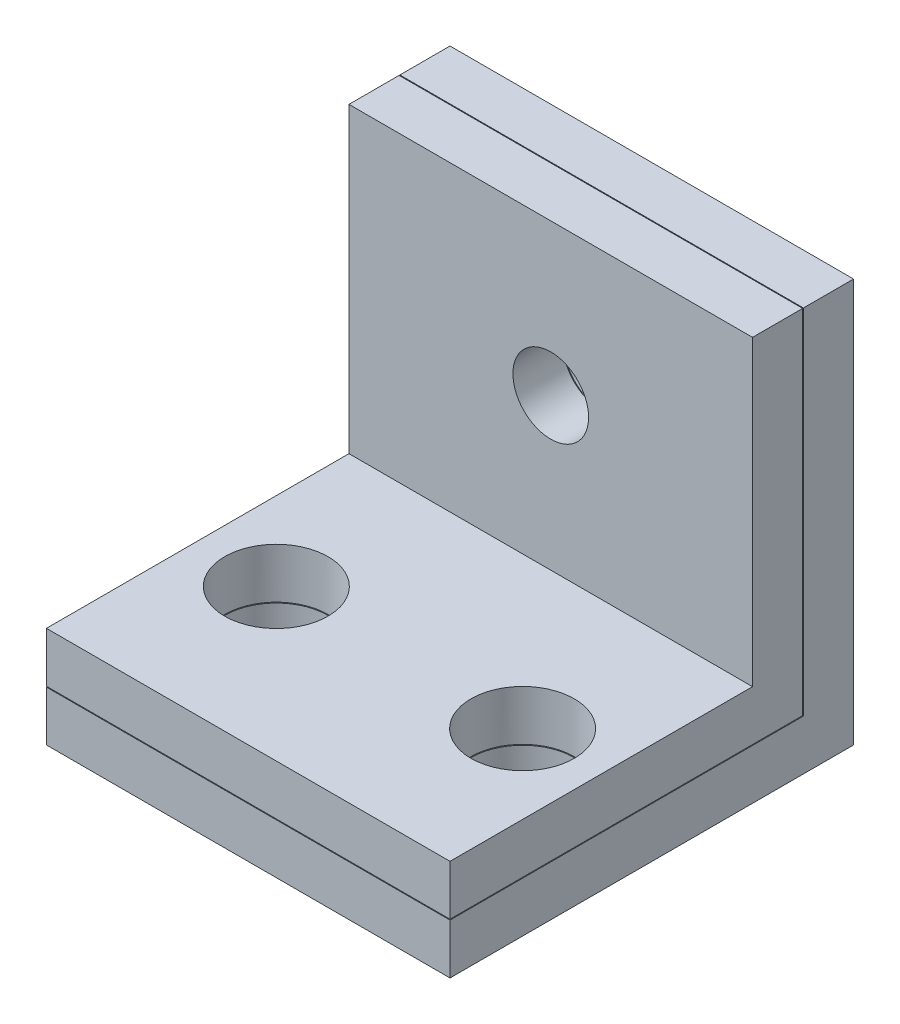
ISO-10303-21;
HEADER;
FILE_DESCRIPTION(('STEP AP214'),'2;1');
FILE_NAME('part.step','',(''),(''),'','','');
FILE_SCHEMA(('AUTOMOTIVE_DESIGN { 1 0 10303 214 1 1 1 1 }'));
ENDSEC;
DATA;
#1=APPLICATION_CONTEXT('core data for automotive mechanical design processes');
#2=APPLICATION_PROTOCOL_DEFINITION('international standard','automotive_design',2000,#1);
#3=PRODUCT_CONTEXT('',#1,'mechanical');
#4=PRODUCT('Part','Part','',(#3));
#5=PRODUCT_RELATED_PRODUCT_CATEGORY('part','',(#4));
#6=PRODUCT_DEFINITION_FORMATION('','',#4);
#7=PRODUCT_DEFINITION_CONTEXT('part definition',#1,'design');
#8=PRODUCT_DEFINITION('design','',#6,#7);
#9=PRODUCT_DEFINITION_SHAPE('','',#8);
#10=(LENGTH_UNIT() NAMED_UNIT(*) SI_UNIT(.MILLI.,.METRE.));
#11=(NAMED_UNIT(*) PLANE_ANGLE_UNIT() SI_UNIT($,.RADIAN.));
#12=(NAMED_UNIT(*) SI_UNIT($,.STERADIAN.) SOLID_ANGLE_UNIT());
#13=UNCERTAINTY_MEASURE_WITH_UNIT(LENGTH_MEASURE(1.E-05),#10,'distance_accuracy_value','');
#14=(GEOMETRIC_REPRESENTATION_CONTEXT(3) GLOBAL_UNCERTAINTY_ASSIGNED_CONTEXT((#13)) GLOBAL_UNIT_ASSIGNED_CONTEXT((#10,
#11,#12)) REPRESENTATION_CONTEXT('',''));
#15=CARTESIAN_POINT('',(0.,0.,0.));
#16=DIRECTION('',(0.,0.,1.));
#17=DIRECTION('',(1.,0.,0.));
#18=AXIS2_PLACEMENT_3D('',#15,#16,#17);
#19=CARTESIAN_POINT('',(0.,12.72,0.));
#20=DIRECTION('',(0.,0.,1.));
#21=DIRECTION('',(1.,0.,0.));
#22=AXIS2_PLACEMENT_3D('',#19,#20,#21);
#23=PLANE('',#22);
#24=DIRECTION('',(0.,-1.,0.));
#25=VECTOR('',#24,1.);
#26=CARTESIAN_POINT('',(50.8,12.72,0.));
#27=LINE('',#26,#25);
#28=CARTESIAN_POINT('',(50.8,12.72,0.));
#29=VERTEX_POINT('',#28);
#30=CARTESIAN_POINT('',(50.8,6.41,0.));
#31=VERTEX_POINT('',#30);
#32=EDGE_CURVE('E129',#29,#31,#27,.T.);
#33=ORIENTED_EDGE('',*,*,#32,.F.);
#34=DIRECTION('',(1.,0.,0.));
#35=VECTOR('',#34,1.);
#36=CARTESIAN_POINT('',(0.,12.72,0.));
#37=LINE('',#36,#35);
#38=CARTESIAN_POINT('',(0.,12.72,0.));
#39=VERTEX_POINT('',#38);
#40=EDGE_CURVE('E12',#39,#29,#37,.T.);
#41=ORIENTED_EDGE('',*,*,#40,.F.);
#42=DIRECTION('',(0.,-1.,0.));
#43=VECTOR('',#42,1.);
#44=CARTESIAN_POINT('',(0.,12.72,0.));
#45=LINE('',#44,#43);
#46=CARTESIAN_POINT('',(0.,6.41,0.));
#47=VERTEX_POINT('',#46);
#48=EDGE_CURVE('E144',#39,#47,#45,.T.);
#49=ORIENTED_EDGE('',*,*,#48,.T.);
#50=DIRECTION('',(1.,0.,0.));
#51=VECTOR('',#50,1.);
#52=CARTESIAN_POINT('',(0.,6.41,0.));
#53=LINE('',#52,#51);
#54=EDGE_CURVE('E93',#47,#31,#53,.T.);
#55=ORIENTED_EDGE('',*,*,#54,.T.);
#56=EDGE_LOOP('',(#33,#41,#49,#55));
#57=FACE_BOUND('',#56,.T.);
#58=ADVANCED_FACE('F43',(#57),#23,.T.);
#59=CARTESIAN_POINT('',(0.,12.72,0.));
#60=DIRECTION('',(0.,1.,0.));
#61=DIRECTION('',(0.,0.,1.));
#62=AXIS2_PLACEMENT_3D('',#59,#60,#61);
#63=PLANE('',#62);
#64=CARTESIAN_POINT('',(9.9,12.72,-19.04));
#65=DIRECTION('',(0.,1.,0.));
#66=DIRECTION('',(0.,0.,1.));
#67=AXIS2_PLACEMENT_3D('',#64,#65,#66);
#68=CIRCLE('',#67,6.50000000000001);
#69=CARTESIAN_POINT('',(9.9,12.72,-12.54));
#70=VERTEX_POINT('',#69);
#71=EDGE_CURVE('E153',#70,#70,#68,.T.);
#72=ORIENTED_EDGE('',*,*,#71,.F.);
#73=EDGE_LOOP('',(#72));
#74=FACE_BOUND('',#73,.T.);
#75=CARTESIAN_POINT('',(40.9,12.72,-19.04));
#76=DIRECTION('',(0.,1.,0.));
#77=DIRECTION('',(0.,0.,1.));
#78=AXIS2_PLACEMENT_3D('',#75,#76,#77);
#79=CIRCLE('',#78,6.5);
#80=CARTESIAN_POINT('',(40.9,12.72,-12.54));
#81=VERTEX_POINT('',#80);
#82=EDGE_CURVE('E170',#81,#81,#79,.T.);
#83=ORIENTED_EDGE('',*,*,#82,.F.);
#84=EDGE_LOOP('',(#83));
#85=FACE_BOUND('',#84,.T.);
#86=DIRECTION('',(0.,0.,1.));
#87=VECTOR('',#86,1.);
#88=CARTESIAN_POINT('',(50.8,12.72,0.));
#89=LINE('',#88,#87);
#90=CARTESIAN_POINT('',(50.8,12.72,-38.08));
#91=VERTEX_POINT('',#90);
#92=EDGE_CURVE('E142',#91,#29,#89,.T.);
#93=ORIENTED_EDGE('',*,*,#92,.F.);
#94=DIRECTION('',(1.,0.,0.));
#95=VECTOR('',#94,1.);
#96=CARTESIAN_POINT('',(0.,12.72,-38.08));
#97=LINE('',#96,#95);
#98=CARTESIAN_POINT('',(0.,12.72,-38.08));
#99=VERTEX_POINT('',#98);
#100=EDGE_CURVE('E52',#99,#91,#97,.T.);
#101=ORIENTED_EDGE('',*,*,#100,.F.);
#102=DIRECTION('',(0.,0.,1.));
#103=VECTOR('',#102,1.);
#104=CARTESIAN_POINT('',(0.,12.72,0.));
#105=LINE('',#104,#103);
#106=EDGE_CURVE('E119',#99,#39,#105,.T.);
#107=ORIENTED_EDGE('',*,*,#106,.T.);
#108=ORIENTED_EDGE('',*,*,#40,.T.);
#109=EDGE_LOOP('',(#93,#101,#107,#108));
#110=FACE_BOUND('',#109,.T.);
#111=ADVANCED_FACE('F187',(#74,#85,#110),#63,.T.);
#112=CARTESIAN_POINT('',(0.,12.72,-38.08));
#113=DIRECTION('',(0.,0.,1.));
#114=DIRECTION('',(1.,0.,0.));
#115=AXIS2_PLACEMENT_3D('',#112,#113,#114);
#116=PLANE('',#115);
#117=CARTESIAN_POINT('',(25.4,31.76,-38.08));
#118=DIRECTION('',(0.,0.,1.));
#119=DIRECTION('',(1.,0.,0.));
#120=AXIS2_PLACEMENT_3D('',#117,#118,#119);
#121=CIRCLE('',#120,4.7625);
#122=CARTESIAN_POINT('',(30.1625,31.76,-38.08));
#123=VERTEX_POINT('',#122);
#124=EDGE_CURVE('E175',#123,#123,#121,.T.);
#125=ORIENTED_EDGE('',*,*,#124,.F.);
#126=EDGE_LOOP('',(#125));
#127=FACE_BOUND('',#126,.T.);
#128=DIRECTION('',(0.,-1.,0.));
#129=VECTOR('',#128,1.);
#130=CARTESIAN_POINT('',(50.8,12.72,-38.08));
#131=LINE('',#130,#129);
#132=CARTESIAN_POINT('',(50.8,50.8,-38.08));
#133=VERTEX_POINT('',#132);
#134=EDGE_CURVE('E106',#133,#91,#131,.T.);
#135=ORIENTED_EDGE('',*,*,#134,.F.);
#136=DIRECTION('',(1.,0.,0.));
#137=VECTOR('',#136,1.);
#138=CARTESIAN_POINT('',(0.,50.8,-38.08));
#139=LINE('',#138,#137);
#140=CARTESIAN_POINT('',(0.,50.8,-38.08));
#141=VERTEX_POINT('',#140);
#142=EDGE_CURVE('E101',#141,#133,#139,.T.);
#143=ORIENTED_EDGE('',*,*,#142,.F.);
#144=DIRECTION('',(0.,-1.,0.));
#145=VECTOR('',#144,1.);
#146=CARTESIAN_POINT('',(0.,12.72,-38.08));
#147=LINE('',#146,#145);
#148=EDGE_CURVE('E104',#141,#99,#147,.T.);
#149=ORIENTED_EDGE('',*,*,#148,.T.);
#150=ORIENTED_EDGE('',*,*,#100,.T.);
#151=EDGE_LOOP('',(#135,#143,#149,#150));
#152=FACE_BOUND('',#151,.T.);
#153=ADVANCED_FACE('F103',(#127,#152),#116,.T.);
#154=CARTESIAN_POINT('',(0.,50.8,-38.08));
#155=DIRECTION('',(0.,1.,0.));
#156=DIRECTION('',(0.,0.,1.));
#157=AXIS2_PLACEMENT_3D('',#154,#155,#156);
#158=PLANE('',#157);
#159=DIRECTION('',(0.,0.,1.));
#160=VECTOR('',#159,1.);
#161=CARTESIAN_POINT('',(50.8,50.8,-38.08));
#162=LINE('',#161,#160);
#163=CARTESIAN_POINT('',(50.8,50.8,-44.39));
#164=VERTEX_POINT('',#163);
#165=EDGE_CURVE('E139',#164,#133,#162,.T.);
#166=ORIENTED_EDGE('',*,*,#165,.F.);
#167=DIRECTION('',(1.,0.,0.));
#168=VECTOR('',#167,1.);
#169=CARTESIAN_POINT('',(0.,50.8,-44.39));
#170=LINE('',#169,#168);
#171=CARTESIAN_POINT('',(0.,50.8,-44.39));
#172=VERTEX_POINT('',#171);
#173=EDGE_CURVE('E111',#172,#164,#170,.T.);
#174=ORIENTED_EDGE('',*,*,#173,.F.);
#175=DIRECTION('',(0.,0.,1.));
#176=VECTOR('',#175,1.);
#177=CARTESIAN_POINT('',(0.,50.8,-38.08));
#178=LINE('',#177,#176);
#179=EDGE_CURVE('E117',#172,#141,#178,.T.);
#180=ORIENTED_EDGE('',*,*,#179,.T.);
#181=ORIENTED_EDGE('',*,*,#142,.T.);
#182=EDGE_LOOP('',(#166,#174,#180,#181));
#183=FACE_BOUND('',#182,.T.);
#184=ADVANCED_FACE('F121',(#183),#158,.T.);
#185=CARTESIAN_POINT('',(0.,6.41,-44.39));
#186=DIRECTION('',(0.,0.,-1.));
#187=DIRECTION('',(-1.,0.,0.));
#188=AXIS2_PLACEMENT_3D('',#185,#186,#187);
#189=PLANE('',#188);
#190=CARTESIAN_POINT('',(25.4,31.76,-44.39));
#191=DIRECTION('',(0.,0.,-1.));
#192=DIRECTION('',(-1.,0.,0.));
#193=AXIS2_PLACEMENT_3D('',#190,#191,#192);
#194=CIRCLE('',#193,4.7625);
#195=CARTESIAN_POINT('',(20.6375,31.76,-44.39));
#196=VERTEX_POINT('',#195);
#197=EDGE_CURVE('E46',#196,#196,#194,.T.);
#198=ORIENTED_EDGE('',*,*,#197,.F.);
#199=EDGE_LOOP('',(#198));
#200=FACE_BOUND('',#199,.T.);
#201=DIRECTION('',(0.,1.,0.));
#202=VECTOR('',#201,1.);
#203=CARTESIAN_POINT('',(50.8,6.41,-44.39));
#204=LINE('',#203,#202);
#205=CARTESIAN_POINT('',(50.8,6.41,-44.39));
#206=VERTEX_POINT('',#205);
#207=EDGE_CURVE('E136',#206,#164,#204,.T.);
#208=ORIENTED_EDGE('',*,*,#207,.F.);
#209=DIRECTION('',(1.,0.,0.));
#210=VECTOR('',#209,1.);
#211=CARTESIAN_POINT('',(0.,6.41,-44.39));
#212=LINE('',#211,#210);
#213=CARTESIAN_POINT('',(0.,6.41,-44.39));
#214=VERTEX_POINT('',#213);
#215=EDGE_CURVE('E148',#214,#206,#212,.T.);
#216=ORIENTED_EDGE('',*,*,#215,.F.);
#217=DIRECTION('',(0.,1.,0.));
#218=VECTOR('',#217,1.);
#219=CARTESIAN_POINT('',(0.,6.41,-44.39));
#220=LINE('',#219,#218);
#221=EDGE_CURVE('E122',#214,#172,#220,.T.);
#222=ORIENTED_EDGE('',*,*,#221,.T.);
#223=ORIENTED_EDGE('',*,*,#173,.T.);
#224=EDGE_LOOP('',(#208,#216,#222,#223));
#225=FACE_BOUND('',#224,.T.);
#226=ADVANCED_FACE('F163',(#200,#225),#189,.T.);
#227=CARTESIAN_POINT('',(0.,6.41,0.));
#228=DIRECTION('',(0.,-1.,0.));
#229=DIRECTION('',(0.,0.,-1.));
#230=AXIS2_PLACEMENT_3D('',#227,#228,#229);
#231=PLANE('',#230);
#232=CARTESIAN_POINT('',(9.9,6.41,-19.04));
#233=DIRECTION('',(0.,-1.,0.));
#234=DIRECTION('',(0.,0.,-1.));
#235=AXIS2_PLACEMENT_3D('',#232,#233,#234);
#236=CIRCLE('',#235,6.50000000000001);
#237=CARTESIAN_POINT('',(9.9,6.41,-25.54));
#238=VERTEX_POINT('',#237);
#239=EDGE_CURVE('E133',#238,#238,#236,.T.);
#240=ORIENTED_EDGE('',*,*,#239,.F.);
#241=EDGE_LOOP('',(#240));
#242=FACE_BOUND('',#241,.T.);
#243=CARTESIAN_POINT('',(40.9,6.41,-19.04));
#244=DIRECTION('',(0.,-1.,0.));
#245=DIRECTION('',(0.,0.,-1.));
#246=AXIS2_PLACEMENT_3D('',#243,#244,#245);
#247=CIRCLE('',#246,6.5);
#248=CARTESIAN_POINT('',(40.9,6.41,-25.54));
#249=VERTEX_POINT('',#248);
#250=EDGE_CURVE('E151',#249,#249,#247,.T.);
#251=ORIENTED_EDGE('',*,*,#250,.F.);
#252=EDGE_LOOP('',(#251));
#253=FACE_BOUND('',#252,.T.);
#254=DIRECTION('',(0.,0.,-1.));
#255=VECTOR('',#254,1.);
#256=CARTESIAN_POINT('',(50.8,6.41,0.));
#257=LINE('',#256,#255);
#258=EDGE_CURVE('E132',#31,#206,#257,.T.);
#259=ORIENTED_EDGE('',*,*,#258,.F.);
#260=ORIENTED_EDGE('',*,*,#54,.F.);
#261=DIRECTION('',(0.,0.,-1.));
#262=VECTOR('',#261,1.);
#263=CARTESIAN_POINT('',(0.,6.41,0.));
#264=LINE('',#263,#262);
#265=EDGE_CURVE('E124',#47,#214,#264,.T.);
#266=ORIENTED_EDGE('',*,*,#265,.T.);
#267=ORIENTED_EDGE('',*,*,#215,.T.);
#268=EDGE_LOOP('',(#259,#260,#266,#267));
#269=FACE_BOUND('',#268,.T.);
#270=ADVANCED_FACE('F160',(#242,#253,#269),#231,.T.);
#271=CARTESIAN_POINT('',(0.,0.,0.));
#272=DIRECTION('',(1.,0.,0.));
#273=DIRECTION('',(0.,0.,-1.));
#274=AXIS2_PLACEMENT_3D('',#271,#272,#273);
#275=PLANE('',#274);
#276=ORIENTED_EDGE('',*,*,#48,.F.);
#277=ORIENTED_EDGE('',*,*,#106,.F.);
#278=ORIENTED_EDGE('',*,*,#148,.F.);
#279=ORIENTED_EDGE('',*,*,#179,.F.);
#280=ORIENTED_EDGE('',*,*,#221,.F.);
#281=ORIENTED_EDGE('',*,*,#265,.F.);
#282=EDGE_LOOP('',(#276,#277,#278,#279,#280,#281));
#283=FACE_BOUND('',#282,.T.);
#284=ADVANCED_FACE('F115',(#283),#275,.F.);
#285=CARTESIAN_POINT('',(50.8,0.,0.));
#286=DIRECTION('',(1.,0.,0.));
#287=DIRECTION('',(0.,0.,-1.));
#288=AXIS2_PLACEMENT_3D('',#285,#286,#287);
#289=PLANE('',#288);
#290=ORIENTED_EDGE('',*,*,#32,.T.);
#291=ORIENTED_EDGE('',*,*,#258,.T.);
#292=ORIENTED_EDGE('',*,*,#207,.T.);
#293=ORIENTED_EDGE('',*,*,#165,.T.);
#294=ORIENTED_EDGE('',*,*,#134,.T.);
#295=ORIENTED_EDGE('',*,*,#92,.T.);
#296=EDGE_LOOP('',(#290,#291,#292,#293,#294,#295));
#297=FACE_BOUND('',#296,.T.);
#298=ADVANCED_FACE('F167',(#297),#289,.T.);
#299=CARTESIAN_POINT('',(40.9,-85.08,-19.04));
#300=DIRECTION('',(0.,1.,0.));
#301=DIRECTION('',(0.,0.,1.));
#302=AXIS2_PLACEMENT_3D('',#299,#300,#301);
#303=CYLINDRICAL_SURFACE('',#302,6.5);
#304=ORIENTED_EDGE('',*,*,#250,.T.);
#305=EDGE_LOOP('',(#304));
#306=FACE_BOUND('',#305,.T.);
#307=ORIENTED_EDGE('',*,*,#82,.T.);
#308=EDGE_LOOP('',(#307));
#309=FACE_BOUND('',#308,.T.);
#310=ADVANCED_FACE('F234',(#306,#309),#303,.F.);
#311=CARTESIAN_POINT('',(9.9,-85.08,-19.04));
#312=DIRECTION('',(0.,1.,0.));
#313=DIRECTION('',(0.,0.,1.));
#314=AXIS2_PLACEMENT_3D('',#311,#312,#313);
#315=CYLINDRICAL_SURFACE('',#314,6.50000000000001);
#316=ORIENTED_EDGE('',*,*,#239,.T.);
#317=EDGE_LOOP('',(#316));
#318=FACE_BOUND('',#317,.T.);
#319=ORIENTED_EDGE('',*,*,#71,.T.);
#320=EDGE_LOOP('',(#319));
#321=FACE_BOUND('',#320,.T.);
#322=ADVANCED_FACE('F157',(#318,#321),#315,.F.);
#323=CARTESIAN_POINT('',(25.4,31.76,-63.08));
#324=DIRECTION('',(0.,0.,1.));
#325=DIRECTION('',(1.,0.,0.));
#326=AXIS2_PLACEMENT_3D('',#323,#324,#325);
#327=CYLINDRICAL_SURFACE('',#326,4.7625);
#328=ORIENTED_EDGE('',*,*,#197,.T.);
#329=EDGE_LOOP('',(#328));
#330=FACE_BOUND('',#329,.T.);
#331=ORIENTED_EDGE('',*,*,#124,.T.);
#332=EDGE_LOOP('',(#331));
#333=FACE_BOUND('',#332,.T.);
#334=ADVANCED_FACE('F182',(#330,#333),#327,.F.);
#335=CLOSED_SHELL('',(#58,#111,#153,#184,#226,#270,#284,#298,#310,#322,#334));
#336=MANIFOLD_SOLID_BREP('B2',#335);
#337=CARTESIAN_POINT('',(50.8,6.31,0.));
#338=DIRECTION('',(0.,0.,-1.));
#339=DIRECTION('',(-1.,0.,0.));
#340=AXIS2_PLACEMENT_3D('',#337,#338,#339);
#341=PLANE('',#340);
#342=DIRECTION('',(0.,-1.,0.));
#343=VECTOR('',#342,1.);
#344=CARTESIAN_POINT('',(0.,6.31,0.));
#345=LINE('',#344,#343);
#346=CARTESIAN_POINT('',(0.,6.31,0.));
#347=VERTEX_POINT('',#346);
#348=CARTESIAN_POINT('',(0.,0.,0.));
#349=VERTEX_POINT('',#348);
#350=EDGE_CURVE('E368',#347,#349,#345,.T.);
#351=ORIENTED_EDGE('',*,*,#350,.T.);
#352=DIRECTION('',(-1.,0.,0.));
#353=VECTOR('',#352,1.);
#354=CARTESIAN_POINT('',(50.8,0.,0.));
#355=LINE('',#354,#353);
#356=CARTESIAN_POINT('',(50.8,0.,0.));
#357=VERTEX_POINT('',#356);
#358=EDGE_CURVE('E41',#357,#349,#355,.T.);
#359=ORIENTED_EDGE('',*,*,#358,.F.);
#360=DIRECTION('',(0.,-1.,0.));
#361=VECTOR('',#360,1.);
#362=CARTESIAN_POINT('',(50.8,6.31,0.));
#363=LINE('',#362,#361);
#364=CARTESIAN_POINT('',(50.8,6.31,0.));
#365=VERTEX_POINT('',#364);
#366=EDGE_CURVE('E379',#365,#357,#363,.T.);
#367=ORIENTED_EDGE('',*,*,#366,.F.);
#368=DIRECTION('',(-1.,0.,0.));
#369=VECTOR('',#368,1.);
#370=CARTESIAN_POINT('',(50.8,6.31,0.));
#371=LINE('',#370,#369);
#372=EDGE_CURVE('E364',#365,#347,#371,.T.);
#373=ORIENTED_EDGE('',*,*,#372,.T.);
#374=EDGE_LOOP('',(#351,#359,#367,#373));
#375=FACE_BOUND('',#374,.T.);
#376=ADVANCED_FACE('F282',(#375),#341,.F.);
#377=CARTESIAN_POINT('',(50.8,0.,0.));
#378=DIRECTION('',(0.,1.,0.));
#379=DIRECTION('',(0.,0.,1.));
#380=AXIS2_PLACEMENT_3D('',#377,#378,#379);
#381=PLANE('',#380);
#382=CARTESIAN_POINT('',(9.9,0.,-19.04));
#383=DIRECTION('',(0.,1.,0.));
#384=DIRECTION('',(0.,0.,1.));
#385=AXIS2_PLACEMENT_3D('',#382,#383,#384);
#386=CIRCLE('',#385,6.50000000000001);
#387=CARTESIAN_POINT('',(9.9,0.,-12.54));
#388=VERTEX_POINT('',#387);
#389=EDGE_CURVE('E372',#388,#388,#386,.T.);
#390=ORIENTED_EDGE('',*,*,#389,.T.);
#391=EDGE_LOOP('',(#390));
#392=FACE_BOUND('',#391,.T.);
#393=CARTESIAN_POINT('',(40.9,0.,-19.04));
#394=DIRECTION('',(0.,1.,0.));
#395=DIRECTION('',(0.,0.,1.));
#396=AXIS2_PLACEMENT_3D('',#393,#394,#395);
#397=CIRCLE('',#396,6.5);
#398=CARTESIAN_POINT('',(40.9,0.,-12.54));
#399=VERTEX_POINT('',#398);
#400=EDGE_CURVE('E387',#399,#399,#397,.T.);
#401=ORIENTED_EDGE('',*,*,#400,.T.);
#402=EDGE_LOOP('',(#401));
#403=FACE_BOUND('',#402,.T.);
#404=DIRECTION('',(0.,0.,-1.));
#405=VECTOR('',#404,1.);
#406=CARTESIAN_POINT('',(0.,0.,0.));
#407=LINE('',#406,#405);
#408=CARTESIAN_POINT('',(0.,0.,-50.8));
#409=VERTEX_POINT('',#408);
#410=EDGE_CURVE('E371',#349,#409,#407,.T.);
#411=ORIENTED_EDGE('',*,*,#410,.T.);
#412=DIRECTION('',(-1.,0.,0.));
#413=VECTOR('',#412,1.);
#414=CARTESIAN_POINT('',(50.8,0.,-50.8));
#415=LINE('',#414,#413);
#416=CARTESIAN_POINT('',(50.8,0.,-50.8));
#417=VERTEX_POINT('',#416);
#418=EDGE_CURVE('E291',#417,#409,#415,.T.);
#419=ORIENTED_EDGE('',*,*,#418,.F.);
#420=DIRECTION('',(0.,0.,-1.));
#421=VECTOR('',#420,1.);
#422=CARTESIAN_POINT('',(50.8,0.,0.));
#423=LINE('',#422,#421);
#424=EDGE_CURVE('E337',#357,#417,#423,.T.);
#425=ORIENTED_EDGE('',*,*,#424,.F.);
#426=ORIENTED_EDGE('',*,*,#358,.T.);
#427=EDGE_LOOP('',(#411,#419,#425,#426));
#428=FACE_BOUND('',#427,.T.);
#429=ADVANCED_FACE('F404',(#392,#403,#428),#381,.F.);
#430=CARTESIAN_POINT('',(50.8,0.,-50.8));
#431=DIRECTION('',(0.,0.,1.));
#432=DIRECTION('',(1.,0.,0.));
#433=AXIS2_PLACEMENT_3D('',#430,#431,#432);
#434=PLANE('',#433);
#435=CARTESIAN_POINT('',(25.4,31.76,-50.8));
#436=DIRECTION('',(0.,0.,1.));
#437=DIRECTION('',(1.,0.,0.));
#438=AXIS2_PLACEMENT_3D('',#435,#436,#437);
#439=CIRCLE('',#438,4.7625);
#440=CARTESIAN_POINT('',(30.1625,31.76,-50.8));
#441=VERTEX_POINT('',#440);
#442=EDGE_CURVE('E388',#441,#441,#439,.T.);
#443=ORIENTED_EDGE('',*,*,#442,.T.);
#444=EDGE_LOOP('',(#443));
#445=FACE_BOUND('',#444,.T.);
#446=DIRECTION('',(0.,1.,0.));
#447=VECTOR('',#446,1.);
#448=CARTESIAN_POINT('',(0.,0.,-50.8));
#449=LINE('',#448,#447);
#450=CARTESIAN_POINT('',(0.,50.8,-50.8));
#451=VERTEX_POINT('',#450);
#452=EDGE_CURVE('E374',#409,#451,#449,.T.);
#453=ORIENTED_EDGE('',*,*,#452,.T.);
#454=DIRECTION('',(-1.,0.,0.));
#455=VECTOR('',#454,1.);
#456=CARTESIAN_POINT('',(50.8,50.8,-50.8));
#457=LINE('',#456,#455);
#458=CARTESIAN_POINT('',(50.8,50.8,-50.8));
#459=VERTEX_POINT('',#458);
#460=EDGE_CURVE('E359',#459,#451,#457,.T.);
#461=ORIENTED_EDGE('',*,*,#460,.F.);
#462=DIRECTION('',(0.,1.,0.));
#463=VECTOR('',#462,1.);
#464=CARTESIAN_POINT('',(50.8,0.,-50.8));
#465=LINE('',#464,#463);
#466=EDGE_CURVE('E350',#417,#459,#465,.T.);
#467=ORIENTED_EDGE('',*,*,#466,.F.);
#468=ORIENTED_EDGE('',*,*,#418,.T.);
#469=EDGE_LOOP('',(#453,#461,#467,#468));
#470=FACE_BOUND('',#469,.T.);
#471=ADVANCED_FACE('F407',(#445,#470),#434,.F.);
#472=CARTESIAN_POINT('',(50.8,50.8,-44.49));
#473=DIRECTION('',(0.,-1.,0.));
#474=DIRECTION('',(0.,0.,-1.));
#475=AXIS2_PLACEMENT_3D('',#472,#473,#474);
#476=PLANE('',#475);
#477=DIRECTION('',(0.,0.,1.));
#478=VECTOR('',#477,1.);
#479=CARTESIAN_POINT('',(0.,50.8,-44.49));
#480=LINE('',#479,#478);
#481=CARTESIAN_POINT('',(0.,50.8,-44.49));
#482=VERTEX_POINT('',#481);
#483=EDGE_CURVE('E358',#451,#482,#480,.T.);
#484=ORIENTED_EDGE('',*,*,#483,.T.);
#485=DIRECTION('',(-1.,0.,0.));
#486=VECTOR('',#485,1.);
#487=CARTESIAN_POINT('',(50.8,50.8,-44.49));
#488=LINE('',#487,#486);
#489=CARTESIAN_POINT('',(50.8,50.8,-44.49));
#490=VERTEX_POINT('',#489);
#491=EDGE_CURVE('E355',#490,#482,#488,.T.);
#492=ORIENTED_EDGE('',*,*,#491,.F.);
#493=DIRECTION('',(0.,0.,1.));
#494=VECTOR('',#493,1.);
#495=CARTESIAN_POINT('',(50.8,50.8,-44.49));
#496=LINE('',#495,#494);
#497=EDGE_CURVE('E344',#459,#490,#496,.T.);
#498=ORIENTED_EDGE('',*,*,#497,.F.);
#499=ORIENTED_EDGE('',*,*,#460,.T.);
#500=EDGE_LOOP('',(#484,#492,#498,#499));
#501=FACE_BOUND('',#500,.T.);
#502=ADVANCED_FACE('F356',(#501),#476,.F.);
#503=CARTESIAN_POINT('',(50.8,6.31,-44.49));
#504=DIRECTION('',(0.,0.,-1.));
#505=DIRECTION('',(-1.,0.,0.));
#506=AXIS2_PLACEMENT_3D('',#503,#504,#505);
#507=PLANE('',#506);
#508=CARTESIAN_POINT('',(25.4,31.76,-44.49));
#509=DIRECTION('',(0.,0.,-1.));
#510=DIRECTION('',(-1.,0.,0.));
#511=AXIS2_PLACEMENT_3D('',#508,#509,#510);
#512=CIRCLE('',#511,4.7625);
#513=CARTESIAN_POINT('',(20.6375,31.76,-44.49));
#514=VERTEX_POINT('',#513);
#515=EDGE_CURVE('E285',#514,#514,#512,.T.);
#516=ORIENTED_EDGE('',*,*,#515,.T.);
#517=EDGE_LOOP('',(#516));
#518=FACE_BOUND('',#517,.T.);
#519=DIRECTION('',(0.,-1.,0.));
#520=VECTOR('',#519,1.);
#521=CARTESIAN_POINT('',(0.,6.31,-44.49));
#522=LINE('',#521,#520);
#523=CARTESIAN_POINT('',(0.,6.31,-44.49));
#524=VERTEX_POINT('',#523);
#525=EDGE_CURVE('E323',#482,#524,#522,.T.);
#526=ORIENTED_EDGE('',*,*,#525,.T.);
#527=DIRECTION('',(-1.,0.,0.));
#528=VECTOR('',#527,1.);
#529=CARTESIAN_POINT('',(50.8,6.31,-44.49));
#530=LINE('',#529,#528);
#531=CARTESIAN_POINT('',(50.8,6.31,-44.49));
#532=VERTEX_POINT('',#531);
#533=EDGE_CURVE('E360',#532,#524,#530,.T.);
#534=ORIENTED_EDGE('',*,*,#533,.F.);
#535=DIRECTION('',(0.,-1.,0.));
#536=VECTOR('',#535,1.);
#537=CARTESIAN_POINT('',(50.8,6.31,-44.49));
#538=LINE('',#537,#536);
#539=EDGE_CURVE('E348',#490,#532,#538,.T.);
#540=ORIENTED_EDGE('',*,*,#539,.F.);
#541=ORIENTED_EDGE('',*,*,#491,.T.);
#542=EDGE_LOOP('',(#526,#534,#540,#541));
#543=FACE_BOUND('',#542,.T.);
#544=ADVANCED_FACE('F362',(#518,#543),#507,.F.);
#545=CARTESIAN_POINT('',(50.8,6.31,0.));
#546=DIRECTION('',(0.,-1.,0.));
#547=DIRECTION('',(0.,0.,-1.));
#548=AXIS2_PLACEMENT_3D('',#545,#546,#547);
#549=PLANE('',#548);
#550=CARTESIAN_POINT('',(9.9,6.31,-19.04));
#551=DIRECTION('',(0.,-1.,0.));
#552=DIRECTION('',(0.,0.,-1.));
#553=AXIS2_PLACEMENT_3D('',#550,#551,#552);
#554=CIRCLE('',#553,6.50000000000001);
#555=CARTESIAN_POINT('',(9.9,6.31,-25.54));
#556=VERTEX_POINT('',#555);
#557=EDGE_CURVE('E389',#556,#556,#554,.T.);
#558=ORIENTED_EDGE('',*,*,#557,.T.);
#559=EDGE_LOOP('',(#558));
#560=FACE_BOUND('',#559,.T.);
#561=CARTESIAN_POINT('',(40.9,6.31,-19.04));
#562=DIRECTION('',(0.,-1.,0.));
#563=DIRECTION('',(0.,0.,-1.));
#564=AXIS2_PLACEMENT_3D('',#561,#562,#563);
#565=CIRCLE('',#564,6.5);
#566=CARTESIAN_POINT('',(40.9,6.31,-25.54));
#567=VERTEX_POINT('',#566);
#568=EDGE_CURVE('E385',#567,#567,#565,.T.);
#569=ORIENTED_EDGE('',*,*,#568,.T.);
#570=EDGE_LOOP('',(#569));
#571=FACE_BOUND('',#570,.T.);
#572=DIRECTION('',(0.,0.,1.));
#573=VECTOR('',#572,1.);
#574=CARTESIAN_POINT('',(0.,6.31,0.));
#575=LINE('',#574,#573);
#576=EDGE_CURVE('E329',#524,#347,#575,.T.);
#577=ORIENTED_EDGE('',*,*,#576,.T.);
#578=ORIENTED_EDGE('',*,*,#372,.F.);
#579=DIRECTION('',(0.,0.,1.));
#580=VECTOR('',#579,1.);
#581=CARTESIAN_POINT('',(50.8,6.31,0.));
#582=LINE('',#581,#580);
#583=EDGE_CURVE('E300',#532,#365,#582,.T.);
#584=ORIENTED_EDGE('',*,*,#583,.F.);
#585=ORIENTED_EDGE('',*,*,#533,.T.);
#586=EDGE_LOOP('',(#577,#578,#584,#585));
#587=FACE_BOUND('',#586,.T.);
#588=ADVANCED_FACE('F412',(#560,#571,#587),#549,.F.);
#589=CARTESIAN_POINT('',(50.8,0.,0.));
#590=DIRECTION('',(1.,0.,0.));
#591=DIRECTION('',(0.,0.,-1.));
#592=AXIS2_PLACEMENT_3D('',#589,#590,#591);
#593=PLANE('',#592);
#594=ORIENTED_EDGE('',*,*,#366,.T.);
#595=ORIENTED_EDGE('',*,*,#424,.T.);
#596=ORIENTED_EDGE('',*,*,#466,.T.);
#597=ORIENTED_EDGE('',*,*,#497,.T.);
#598=ORIENTED_EDGE('',*,*,#539,.T.);
#599=ORIENTED_EDGE('',*,*,#583,.T.);
#600=EDGE_LOOP('',(#594,#595,#596,#597,#598,#599));
#601=FACE_BOUND('',#600,.T.);
#602=ADVANCED_FACE('F346',(#601),#593,.T.);
#603=CARTESIAN_POINT('',(0.,0.,0.));
#604=DIRECTION('',(1.,0.,0.));
#605=DIRECTION('',(0.,0.,-1.));
#606=AXIS2_PLACEMENT_3D('',#603,#604,#605);
#607=PLANE('',#606);
#608=ORIENTED_EDGE('',*,*,#350,.F.);
#609=ORIENTED_EDGE('',*,*,#576,.F.);
#610=ORIENTED_EDGE('',*,*,#525,.F.);
#611=ORIENTED_EDGE('',*,*,#483,.F.);
#612=ORIENTED_EDGE('',*,*,#452,.F.);
#613=ORIENTED_EDGE('',*,*,#410,.F.);
#614=EDGE_LOOP('',(#608,#609,#610,#611,#612,#613));
#615=FACE_BOUND('',#614,.T.);
#616=ADVANCED_FACE('F410',(#615),#607,.F.);
#617=CARTESIAN_POINT('',(40.9,-85.08,-19.04));
#618=DIRECTION('',(0.,1.,0.));
#619=DIRECTION('',(0.,0.,1.));
#620=AXIS2_PLACEMENT_3D('',#617,#618,#619);
#621=CYLINDRICAL_SURFACE('',#620,6.5);
#622=ORIENTED_EDGE('',*,*,#568,.F.);
#623=EDGE_LOOP('',(#622));
#624=FACE_BOUND('',#623,.T.);
#625=ORIENTED_EDGE('',*,*,#400,.F.);
#626=EDGE_LOOP('',(#625));
#627=FACE_BOUND('',#626,.T.);
#628=ADVANCED_FACE('F463',(#624,#627),#621,.F.);
#629=CARTESIAN_POINT('',(9.9,-85.08,-19.04));
#630=DIRECTION('',(0.,1.,0.));
#631=DIRECTION('',(0.,0.,1.));
#632=AXIS2_PLACEMENT_3D('',#629,#630,#631);
#633=CYLINDRICAL_SURFACE('',#632,6.50000000000001);
#634=ORIENTED_EDGE('',*,*,#557,.F.);
#635=EDGE_LOOP('',(#634));
#636=FACE_BOUND('',#635,.T.);
#637=ORIENTED_EDGE('',*,*,#389,.F.);
#638=EDGE_LOOP('',(#637));
#639=FACE_BOUND('',#638,.T.);
#640=ADVANCED_FACE('F468',(#636,#639),#633,.F.);
#641=CARTESIAN_POINT('',(25.4,31.76,-63.08));
#642=DIRECTION('',(0.,0.,1.));
#643=DIRECTION('',(1.,0.,0.));
#644=AXIS2_PLACEMENT_3D('',#641,#642,#643);
#645=CYLINDRICAL_SURFACE('',#644,4.7625);
#646=ORIENTED_EDGE('',*,*,#515,.F.);
#647=EDGE_LOOP('',(#646));
#648=FACE_BOUND('',#647,.T.);
#649=ORIENTED_EDGE('',*,*,#442,.F.);
#650=EDGE_LOOP('',(#649));
#651=FACE_BOUND('',#650,.T.);
#652=ADVANCED_FACE('F476',(#648,#651),#645,.F.);
#653=CLOSED_SHELL('',(#376,#429,#471,#502,#544,#588,#602,#616,#628,#640,#652));
#654=MANIFOLD_SOLID_BREP('B6',#653);
#655=ADVANCED_BREP_SHAPE_REPRESENTATION('',(#18,#336,#654),#14);
#656=SHAPE_DEFINITION_REPRESENTATION(#9,#655);
ENDSEC;
END-ISO-10303-21;
